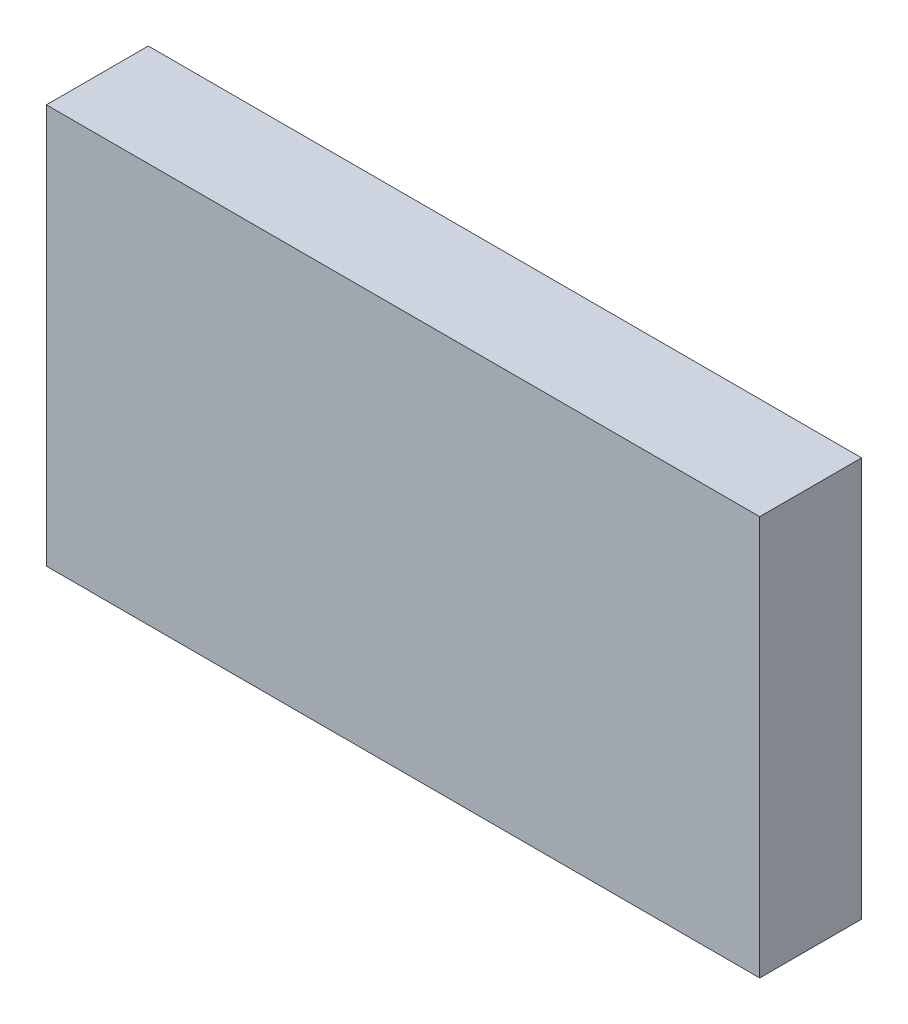
ISO-10303-21;
HEADER;
FILE_DESCRIPTION(('STEP AP214'),'2;1');
FILE_NAME('part.step','',(''),(''),'','','');
FILE_SCHEMA(('AUTOMOTIVE_DESIGN { 1 0 10303 214 1 1 1 1 }'));
ENDSEC;
DATA;
#1=APPLICATION_CONTEXT('core data for automotive mechanical design processes');
#2=APPLICATION_PROTOCOL_DEFINITION('international standard','automotive_design',2000,#1);
#3=PRODUCT_CONTEXT('',#1,'mechanical');
#4=PRODUCT('Part','Part','',(#3));
#5=PRODUCT_RELATED_PRODUCT_CATEGORY('part','',(#4));
#6=PRODUCT_DEFINITION_FORMATION('','',#4);
#7=PRODUCT_DEFINITION_CONTEXT('part definition',#1,'design');
#8=PRODUCT_DEFINITION('design','',#6,#7);
#9=PRODUCT_DEFINITION_SHAPE('','',#8);
#10=(LENGTH_UNIT() NAMED_UNIT(*) SI_UNIT(.MILLI.,.METRE.));
#11=(NAMED_UNIT(*) PLANE_ANGLE_UNIT() SI_UNIT($,.RADIAN.));
#12=(NAMED_UNIT(*) SI_UNIT($,.STERADIAN.) SOLID_ANGLE_UNIT());
#13=UNCERTAINTY_MEASURE_WITH_UNIT(LENGTH_MEASURE(1.E-05),#10,'distance_accuracy_value','');
#14=(GEOMETRIC_REPRESENTATION_CONTEXT(3) GLOBAL_UNCERTAINTY_ASSIGNED_CONTEXT((#13)) GLOBAL_UNIT_ASSIGNED_CONTEXT((#10,
#11,#12)) REPRESENTATION_CONTEXT('',''));
#15=CARTESIAN_POINT('',(0.,0.,0.));
#16=DIRECTION('',(0.,0.,1.));
#17=DIRECTION('',(1.,0.,0.));
#18=AXIS2_PLACEMENT_3D('',#15,#16,#17);
#19=CARTESIAN_POINT('',(0.,0.,10.));
#20=DIRECTION('',(1.,0.,0.));
#21=DIRECTION('',(0.,0.,-1.));
#22=AXIS2_PLACEMENT_3D('',#19,#20,#21);
#23=PLANE('',#22);
#24=DIRECTION('',(0.,-1.,0.));
#25=VECTOR('',#24,1.);
#26=CARTESIAN_POINT('',(0.,0.,0.));
#27=LINE('',#26,#25);
#28=CARTESIAN_POINT('',(0.,0.,0.));
#29=VERTEX_POINT('',#28);
#30=CARTESIAN_POINT('',(0.,-39.2205882352941,0.));
#31=VERTEX_POINT('',#30);
#32=EDGE_CURVE('E96',#29,#31,#27,.T.);
#33=ORIENTED_EDGE('',*,*,#32,.T.);
#34=DIRECTION('',(0.,0.,-1.));
#35=VECTOR('',#34,1.);
#36=CARTESIAN_POINT('',(0.,-39.2205882352941,10.));
#37=LINE('',#36,#35);
#38=CARTESIAN_POINT('',(0.,-39.2205882352941,10.));
#39=VERTEX_POINT('',#38);
#40=EDGE_CURVE('E11',#39,#31,#37,.T.);
#41=ORIENTED_EDGE('',*,*,#40,.F.);
#42=DIRECTION('',(0.,-1.,0.));
#43=VECTOR('',#42,1.);
#44=CARTESIAN_POINT('',(0.,0.,10.));
#45=LINE('',#44,#43);
#46=CARTESIAN_POINT('',(0.,0.,10.));
#47=VERTEX_POINT('',#46);
#48=EDGE_CURVE('E84',#47,#39,#45,.T.);
#49=ORIENTED_EDGE('',*,*,#48,.F.);
#50=DIRECTION('',(0.,0.,-1.));
#51=VECTOR('',#50,1.);
#52=CARTESIAN_POINT('',(0.,0.,10.));
#53=LINE('',#52,#51);
#54=EDGE_CURVE('E92',#47,#29,#53,.T.);
#55=ORIENTED_EDGE('',*,*,#54,.T.);
#56=EDGE_LOOP('',(#33,#41,#49,#55));
#57=FACE_BOUND('',#56,.T.);
#58=ADVANCED_FACE('F33',(#57),#23,.F.);
#59=CARTESIAN_POINT('',(0.,-39.2205882352941,10.));
#60=DIRECTION('',(0.,1.,0.));
#61=DIRECTION('',(0.,0.,1.));
#62=AXIS2_PLACEMENT_3D('',#59,#60,#61);
#63=PLANE('',#62);
#64=DIRECTION('',(1.,0.,0.));
#65=VECTOR('',#64,1.);
#66=CARTESIAN_POINT('',(0.,-39.2205882352941,0.));
#67=LINE('',#66,#65);
#68=CARTESIAN_POINT('',(70.0224629040805,-39.2205882352941,0.));
#69=VERTEX_POINT('',#68);
#70=EDGE_CURVE('E88',#31,#69,#67,.T.);
#71=ORIENTED_EDGE('',*,*,#70,.T.);
#72=DIRECTION('',(0.,0.,-1.));
#73=VECTOR('',#72,1.);
#74=CARTESIAN_POINT('',(70.0224629040805,-39.2205882352941,10.));
#75=LINE('',#74,#73);
#76=CARTESIAN_POINT('',(70.0224629040805,-39.2205882352941,10.));
#77=VERTEX_POINT('',#76);
#78=EDGE_CURVE('E41',#77,#69,#75,.T.);
#79=ORIENTED_EDGE('',*,*,#78,.F.);
#80=DIRECTION('',(1.,0.,0.));
#81=VECTOR('',#80,1.);
#82=CARTESIAN_POINT('',(0.,-39.2205882352941,10.));
#83=LINE('',#82,#81);
#84=EDGE_CURVE('E79',#39,#77,#83,.T.);
#85=ORIENTED_EDGE('',*,*,#84,.F.);
#86=ORIENTED_EDGE('',*,*,#40,.T.);
#87=EDGE_LOOP('',(#71,#79,#85,#86));
#88=FACE_BOUND('',#87,.T.);
#89=ADVANCED_FACE('F87',(#88),#63,.F.);
#90=CARTESIAN_POINT('',(70.0224629040805,0.,10.));
#91=DIRECTION('',(-1.,0.,0.));
#92=DIRECTION('',(0.,0.,1.));
#93=AXIS2_PLACEMENT_3D('',#90,#91,#92);
#94=PLANE('',#93);
#95=DIRECTION('',(0.,1.,0.));
#96=VECTOR('',#95,1.);
#97=CARTESIAN_POINT('',(70.0224629040805,0.,0.));
#98=LINE('',#97,#96);
#99=CARTESIAN_POINT('',(70.0224629040805,0.,0.));
#100=VERTEX_POINT('',#99);
#101=EDGE_CURVE('E66',#69,#100,#98,.T.);
#102=ORIENTED_EDGE('',*,*,#101,.T.);
#103=DIRECTION('',(0.,0.,-1.));
#104=VECTOR('',#103,1.);
#105=CARTESIAN_POINT('',(70.0224629040805,0.,10.));
#106=LINE('',#105,#104);
#107=CARTESIAN_POINT('',(70.0224629040805,0.,10.));
#108=VERTEX_POINT('',#107);
#109=EDGE_CURVE('E89',#108,#100,#106,.T.);
#110=ORIENTED_EDGE('',*,*,#109,.F.);
#111=DIRECTION('',(0.,1.,0.));
#112=VECTOR('',#111,1.);
#113=CARTESIAN_POINT('',(70.0224629040805,0.,10.));
#114=LINE('',#113,#112);
#115=EDGE_CURVE('E82',#77,#108,#114,.T.);
#116=ORIENTED_EDGE('',*,*,#115,.F.);
#117=ORIENTED_EDGE('',*,*,#78,.T.);
#118=EDGE_LOOP('',(#102,#110,#116,#117));
#119=FACE_BOUND('',#118,.T.);
#120=ADVANCED_FACE('F90',(#119),#94,.F.);
#121=CARTESIAN_POINT('',(0.,0.,10.));
#122=DIRECTION('',(0.,-1.,0.));
#123=DIRECTION('',(0.,0.,-1.));
#124=AXIS2_PLACEMENT_3D('',#121,#122,#123);
#125=PLANE('',#124);
#126=DIRECTION('',(-1.,0.,0.));
#127=VECTOR('',#126,1.);
#128=CARTESIAN_POINT('',(0.,0.,0.));
#129=LINE('',#128,#127);
#130=EDGE_CURVE('E72',#100,#29,#129,.T.);
#131=ORIENTED_EDGE('',*,*,#130,.T.);
#132=ORIENTED_EDGE('',*,*,#54,.F.);
#133=DIRECTION('',(-1.,0.,0.));
#134=VECTOR('',#133,1.);
#135=CARTESIAN_POINT('',(0.,0.,10.));
#136=LINE('',#135,#134);
#137=EDGE_CURVE('E49',#108,#47,#136,.T.);
#138=ORIENTED_EDGE('',*,*,#137,.F.);
#139=ORIENTED_EDGE('',*,*,#109,.T.);
#140=EDGE_LOOP('',(#131,#132,#138,#139));
#141=FACE_BOUND('',#140,.T.);
#142=ADVANCED_FACE('F103',(#141),#125,.F.);
#143=CARTESIAN_POINT('',(0.,0.,10.));
#144=DIRECTION('',(0.,0.,1.));
#145=DIRECTION('',(1.,0.,0.));
#146=AXIS2_PLACEMENT_3D('',#143,#144,#145);
#147=PLANE('',#146);
#148=ORIENTED_EDGE('',*,*,#48,.T.);
#149=ORIENTED_EDGE('',*,*,#84,.T.);
#150=ORIENTED_EDGE('',*,*,#115,.T.);
#151=ORIENTED_EDGE('',*,*,#137,.T.);
#152=EDGE_LOOP('',(#148,#149,#150,#151));
#153=FACE_BOUND('',#152,.T.);
#154=ADVANCED_FACE('F80',(#153),#147,.T.);
#155=CARTESIAN_POINT('',(0.,0.,0.));
#156=DIRECTION('',(0.,0.,1.));
#157=DIRECTION('',(1.,0.,0.));
#158=AXIS2_PLACEMENT_3D('',#155,#156,#157);
#159=PLANE('',#158);
#160=ORIENTED_EDGE('',*,*,#32,.F.);
#161=ORIENTED_EDGE('',*,*,#130,.F.);
#162=ORIENTED_EDGE('',*,*,#101,.F.);
#163=ORIENTED_EDGE('',*,*,#70,.F.);
#164=EDGE_LOOP('',(#160,#161,#162,#163));
#165=FACE_BOUND('',#164,.T.);
#166=ADVANCED_FACE('F106',(#165),#159,.F.);
#167=CLOSED_SHELL('',(#58,#89,#120,#142,#154,#166));
#168=MANIFOLD_SOLID_BREP('B2',#167);
#169=ADVANCED_BREP_SHAPE_REPRESENTATION('',(#18,#168),#14);
#170=SHAPE_DEFINITION_REPRESENTATION(#9,#169);
ENDSEC;
END-ISO-10303-21;
